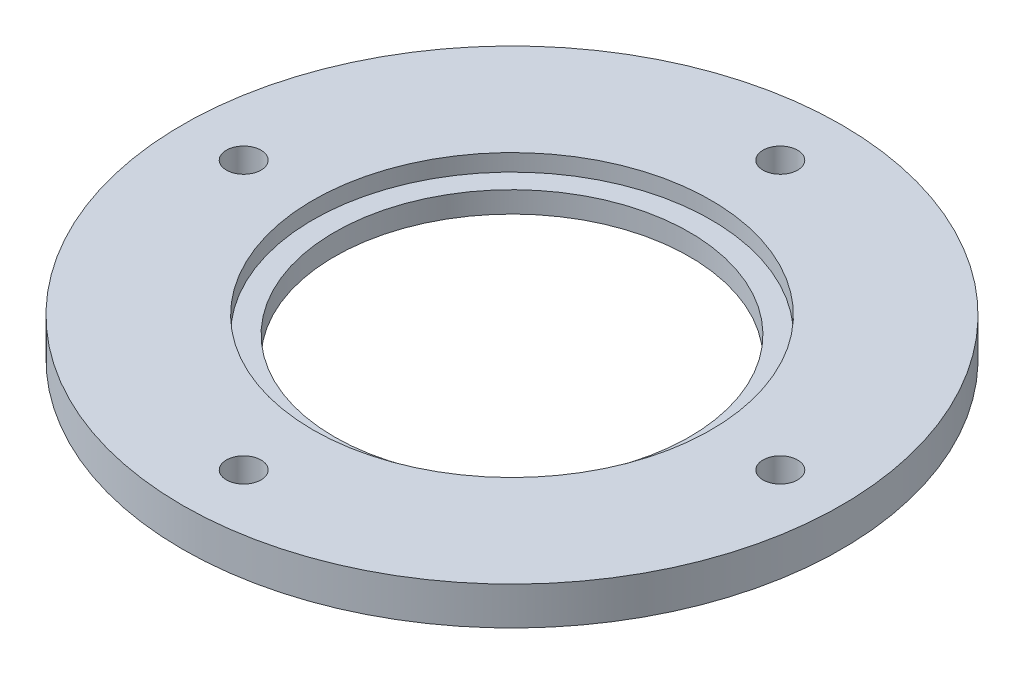
ISO-10303-21;
HEADER;
FILE_DESCRIPTION(('STEP AP214'),'2;1');
FILE_NAME('part.step','',(''),(''),'','','');
FILE_SCHEMA(('AUTOMOTIVE_DESIGN { 1 0 10303 214 1 1 1 1 }'));
ENDSEC;
DATA;
#1=APPLICATION_CONTEXT('core data for automotive mechanical design processes');
#2=APPLICATION_PROTOCOL_DEFINITION('international standard','automotive_design',2000,#1);
#3=PRODUCT_CONTEXT('',#1,'mechanical');
#4=PRODUCT('Part','Part','',(#3));
#5=PRODUCT_RELATED_PRODUCT_CATEGORY('part','',(#4));
#6=PRODUCT_DEFINITION_FORMATION('','',#4);
#7=PRODUCT_DEFINITION_CONTEXT('part definition',#1,'design');
#8=PRODUCT_DEFINITION('design','',#6,#7);
#9=PRODUCT_DEFINITION_SHAPE('','',#8);
#10=(LENGTH_UNIT() NAMED_UNIT(*) SI_UNIT(.MILLI.,.METRE.));
#11=(NAMED_UNIT(*) PLANE_ANGLE_UNIT() SI_UNIT($,.RADIAN.));
#12=(NAMED_UNIT(*) SI_UNIT($,.STERADIAN.) SOLID_ANGLE_UNIT());
#13=UNCERTAINTY_MEASURE_WITH_UNIT(LENGTH_MEASURE(1.E-05),#10,'distance_accuracy_value','');
#14=(GEOMETRIC_REPRESENTATION_CONTEXT(3) GLOBAL_UNCERTAINTY_ASSIGNED_CONTEXT((#13)) GLOBAL_UNIT_ASSIGNED_CONTEXT((#10,
#11,#12)) REPRESENTATION_CONTEXT('',''));
#15=CARTESIAN_POINT('',(0.,0.,0.));
#16=DIRECTION('',(0.,0.,1.));
#17=DIRECTION('',(1.,0.,0.));
#18=AXIS2_PLACEMENT_3D('',#15,#16,#17);
#19=CARTESIAN_POINT('',(0.,0.,0.));
#20=DIRECTION('',(0.,1.,0.));
#21=DIRECTION('',(0.,0.,1.));
#22=AXIS2_PLACEMENT_3D('',#19,#20,#21);
#23=CYLINDRICAL_SURFACE('',#22,21.);
#24=CARTESIAN_POINT('',(0.,0.,0.));
#25=DIRECTION('',(0.,1.,0.));
#26=DIRECTION('',(0.,0.,1.));
#27=AXIS2_PLACEMENT_3D('',#24,#25,#26);
#28=CIRCLE('',#27,21.);
#29=CARTESIAN_POINT('',(0.,0.,21.));
#30=VERTEX_POINT('',#29);
#31=EDGE_CURVE('E50',#30,#30,#28,.T.);
#32=ORIENTED_EDGE('',*,*,#31,.F.);
#33=EDGE_LOOP('',(#32));
#34=FACE_BOUND('',#33,.T.);
#35=CARTESIAN_POINT('',(0.,2.5,0.));
#36=DIRECTION('',(0.,1.,0.));
#37=DIRECTION('',(0.,0.,1.));
#38=AXIS2_PLACEMENT_3D('',#35,#36,#37);
#39=CIRCLE('',#38,21.);
#40=CARTESIAN_POINT('',(0.,2.5,21.));
#41=VERTEX_POINT('',#40);
#42=EDGE_CURVE('E35',#41,#41,#39,.F.);
#43=ORIENTED_EDGE('',*,*,#42,.F.);
#44=EDGE_LOOP('',(#43));
#45=FACE_BOUND('',#44,.T.);
#46=ADVANCED_FACE('F31',(#34,#45),#23,.F.);
#47=CARTESIAN_POINT('',(0.,4.5,0.));
#48=DIRECTION('',(0.,-1.,0.));
#49=DIRECTION('',(0.,0.,-1.));
#50=AXIS2_PLACEMENT_3D('',#47,#48,#49);
#51=CYLINDRICAL_SURFACE('',#50,39.);
#52=CARTESIAN_POINT('',(0.,4.5,0.));
#53=DIRECTION('',(0.,1.,0.));
#54=DIRECTION('',(0.,0.,1.));
#55=AXIS2_PLACEMENT_3D('',#52,#53,#54);
#56=CIRCLE('',#55,39.);
#57=CARTESIAN_POINT('',(0.,4.5,39.));
#58=VERTEX_POINT('',#57);
#59=EDGE_CURVE('E10',#58,#58,#56,.T.);
#60=ORIENTED_EDGE('',*,*,#59,.F.);
#61=EDGE_LOOP('',(#60));
#62=FACE_BOUND('',#61,.T.);
#63=CARTESIAN_POINT('',(0.,0.,0.));
#64=DIRECTION('',(0.,1.,0.));
#65=DIRECTION('',(0.,0.,1.));
#66=AXIS2_PLACEMENT_3D('',#63,#64,#65);
#67=CIRCLE('',#66,39.);
#68=CARTESIAN_POINT('',(0.,0.,39.));
#69=VERTEX_POINT('',#68);
#70=EDGE_CURVE('E39',#69,#69,#67,.T.);
#71=ORIENTED_EDGE('',*,*,#70,.T.);
#72=EDGE_LOOP('',(#71));
#73=FACE_BOUND('',#72,.T.);
#74=ADVANCED_FACE('F33',(#62,#73),#51,.T.);
#75=CARTESIAN_POINT('',(0.,4.5,0.));
#76=DIRECTION('',(0.,1.,0.));
#77=DIRECTION('',(0.,0.,1.));
#78=AXIS2_PLACEMENT_3D('',#75,#76,#77);
#79=PLANE('',#78);
#80=CARTESIAN_POINT('',(0.,4.5,0.));
#81=DIRECTION('',(0.,1.,0.));
#82=DIRECTION('',(0.,0.,1.));
#83=AXIS2_PLACEMENT_3D('',#80,#81,#82);
#84=CIRCLE('',#83,23.55);
#85=CARTESIAN_POINT('',(0.,4.5,23.55));
#86=VERTEX_POINT('',#85);
#87=EDGE_CURVE('E72',#86,#86,#84,.T.);
#88=ORIENTED_EDGE('',*,*,#87,.F.);
#89=EDGE_LOOP('',(#88));
#90=FACE_BOUND('',#89,.T.);
#91=CARTESIAN_POINT('',(31.75,4.5,0.));
#92=DIRECTION('',(0.,1.,0.));
#93=DIRECTION('',(0.,0.,1.));
#94=AXIS2_PLACEMENT_3D('',#91,#92,#93);
#95=CIRCLE('',#94,2.04999999999999);
#96=CARTESIAN_POINT('',(31.75,4.5,2.04999999999999));
#97=VERTEX_POINT('',#96);
#98=EDGE_CURVE('E65',#97,#97,#95,.T.);
#99=ORIENTED_EDGE('',*,*,#98,.F.);
#100=EDGE_LOOP('',(#99));
#101=FACE_BOUND('',#100,.T.);
#102=CARTESIAN_POINT('',(-1.10854532508269E-13,4.5,31.75));
#103=DIRECTION('',(0.,1.,0.));
#104=DIRECTION('',(0.,0.,1.));
#105=AXIS2_PLACEMENT_3D('',#102,#103,#104);
#106=CIRCLE('',#105,2.05);
#107=CARTESIAN_POINT('',(-1.10854532508269E-13,4.5,33.8));
#108=VERTEX_POINT('',#107);
#109=EDGE_CURVE('E59',#108,#108,#106,.T.);
#110=ORIENTED_EDGE('',*,*,#109,.F.);
#111=EDGE_LOOP('',(#110));
#112=FACE_BOUND('',#111,.T.);
#113=CARTESIAN_POINT('',(-31.75,4.5,-2.21709065016539E-13));
#114=DIRECTION('',(0.,1.,0.));
#115=DIRECTION('',(0.,0.,1.));
#116=AXIS2_PLACEMENT_3D('',#113,#114,#115);
#117=CIRCLE('',#116,2.05);
#118=CARTESIAN_POINT('',(-31.75,4.5,2.04999999999978));
#119=VERTEX_POINT('',#118);
#120=EDGE_CURVE('E53',#119,#119,#117,.T.);
#121=ORIENTED_EDGE('',*,*,#120,.F.);
#122=EDGE_LOOP('',(#121));
#123=FACE_BOUND('',#122,.T.);
#124=CARTESIAN_POINT('',(3.32563597524808E-13,4.5,-31.75));
#125=DIRECTION('',(0.,1.,0.));
#126=DIRECTION('',(0.,0.,1.));
#127=AXIS2_PLACEMENT_3D('',#124,#125,#126);
#128=CIRCLE('',#127,2.05);
#129=CARTESIAN_POINT('',(3.32563597524808E-13,4.5,-29.7));
#130=VERTEX_POINT('',#129);
#131=EDGE_CURVE('E46',#130,#130,#128,.T.);
#132=ORIENTED_EDGE('',*,*,#131,.F.);
#133=EDGE_LOOP('',(#132));
#134=FACE_BOUND('',#133,.T.);
#135=ORIENTED_EDGE('',*,*,#59,.T.);
#136=EDGE_LOOP('',(#135));
#137=FACE_BOUND('',#136,.T.);
#138=ADVANCED_FACE('F90',(#90,#101,#112,#123,#134,#137),#79,.T.);
#139=CARTESIAN_POINT('',(0.,0.,0.));
#140=DIRECTION('',(0.,1.,0.));
#141=DIRECTION('',(0.,0.,1.));
#142=AXIS2_PLACEMENT_3D('',#139,#140,#141);
#143=PLANE('',#142);
#144=ORIENTED_EDGE('',*,*,#31,.T.);
#145=EDGE_LOOP('',(#144));
#146=FACE_BOUND('',#145,.T.);
#147=CARTESIAN_POINT('',(31.75,0.,0.));
#148=DIRECTION('',(0.,1.,0.));
#149=DIRECTION('',(0.,0.,1.));
#150=AXIS2_PLACEMENT_3D('',#147,#148,#149);
#151=CIRCLE('',#150,2.04999999999999);
#152=CARTESIAN_POINT('',(31.75,0.,2.04999999999999));
#153=VERTEX_POINT('',#152);
#154=EDGE_CURVE('E44',#153,#153,#151,.T.);
#155=ORIENTED_EDGE('',*,*,#154,.T.);
#156=EDGE_LOOP('',(#155));
#157=FACE_BOUND('',#156,.T.);
#158=CARTESIAN_POINT('',(-1.10854532508269E-13,0.,31.75));
#159=DIRECTION('',(0.,1.,0.));
#160=DIRECTION('',(0.,0.,1.));
#161=AXIS2_PLACEMENT_3D('',#158,#159,#160);
#162=CIRCLE('',#161,2.05);
#163=CARTESIAN_POINT('',(-1.10854532508269E-13,0.,33.8));
#164=VERTEX_POINT('',#163);
#165=EDGE_CURVE('E62',#164,#164,#162,.T.);
#166=ORIENTED_EDGE('',*,*,#165,.T.);
#167=EDGE_LOOP('',(#166));
#168=FACE_BOUND('',#167,.T.);
#169=CARTESIAN_POINT('',(-31.75,0.,-2.21709065016539E-13));
#170=DIRECTION('',(0.,1.,0.));
#171=DIRECTION('',(0.,0.,1.));
#172=AXIS2_PLACEMENT_3D('',#169,#170,#171);
#173=CIRCLE('',#172,2.05);
#174=CARTESIAN_POINT('',(-31.75,0.,2.04999999999978));
#175=VERTEX_POINT('',#174);
#176=EDGE_CURVE('E56',#175,#175,#173,.T.);
#177=ORIENTED_EDGE('',*,*,#176,.T.);
#178=EDGE_LOOP('',(#177));
#179=FACE_BOUND('',#178,.T.);
#180=CARTESIAN_POINT('',(3.32563597524808E-13,0.,-31.75));
#181=DIRECTION('',(0.,1.,0.));
#182=DIRECTION('',(0.,0.,1.));
#183=AXIS2_PLACEMENT_3D('',#180,#181,#182);
#184=CIRCLE('',#183,2.05);
#185=CARTESIAN_POINT('',(3.32563597524808E-13,0.,-29.7));
#186=VERTEX_POINT('',#185);
#187=EDGE_CURVE('E49',#186,#186,#184,.T.);
#188=ORIENTED_EDGE('',*,*,#187,.T.);
#189=EDGE_LOOP('',(#188));
#190=FACE_BOUND('',#189,.T.);
#191=ORIENTED_EDGE('',*,*,#70,.F.);
#192=EDGE_LOOP('',(#191));
#193=FACE_BOUND('',#192,.T.);
#194=ADVANCED_FACE('F112',(#146,#157,#168,#179,#190,#193),#143,.F.);
#195=CARTESIAN_POINT('',(3.32563597524808E-13,0.,-31.75));
#196=DIRECTION('',(0.,1.,0.));
#197=DIRECTION('',(0.,0.,1.));
#198=AXIS2_PLACEMENT_3D('',#195,#196,#197);
#199=CYLINDRICAL_SURFACE('',#198,2.05);
#200=ORIENTED_EDGE('',*,*,#187,.F.);
#201=EDGE_LOOP('',(#200));
#202=FACE_BOUND('',#201,.T.);
#203=ORIENTED_EDGE('',*,*,#131,.T.);
#204=EDGE_LOOP('',(#203));
#205=FACE_BOUND('',#204,.T.);
#206=ADVANCED_FACE('F108',(#202,#205),#199,.F.);
#207=CARTESIAN_POINT('',(-31.75,0.,-2.21709065016539E-13));
#208=DIRECTION('',(0.,1.,0.));
#209=DIRECTION('',(0.,0.,1.));
#210=AXIS2_PLACEMENT_3D('',#207,#208,#209);
#211=CYLINDRICAL_SURFACE('',#210,2.05);
#212=ORIENTED_EDGE('',*,*,#176,.F.);
#213=EDGE_LOOP('',(#212));
#214=FACE_BOUND('',#213,.T.);
#215=ORIENTED_EDGE('',*,*,#120,.T.);
#216=EDGE_LOOP('',(#215));
#217=FACE_BOUND('',#216,.T.);
#218=ADVANCED_FACE('F104',(#214,#217),#211,.F.);
#219=CARTESIAN_POINT('',(-1.10854532508269E-13,0.,31.75));
#220=DIRECTION('',(0.,1.,0.));
#221=DIRECTION('',(0.,0.,1.));
#222=AXIS2_PLACEMENT_3D('',#219,#220,#221);
#223=CYLINDRICAL_SURFACE('',#222,2.05);
#224=ORIENTED_EDGE('',*,*,#165,.F.);
#225=EDGE_LOOP('',(#224));
#226=FACE_BOUND('',#225,.T.);
#227=ORIENTED_EDGE('',*,*,#109,.T.);
#228=EDGE_LOOP('',(#227));
#229=FACE_BOUND('',#228,.T.);
#230=ADVANCED_FACE('F100',(#226,#229),#223,.F.);
#231=CARTESIAN_POINT('',(31.75,0.,0.));
#232=DIRECTION('',(0.,1.,0.));
#233=DIRECTION('',(0.,0.,1.));
#234=AXIS2_PLACEMENT_3D('',#231,#232,#233);
#235=CYLINDRICAL_SURFACE('',#234,2.04999999999999);
#236=ORIENTED_EDGE('',*,*,#154,.F.);
#237=EDGE_LOOP('',(#236));
#238=FACE_BOUND('',#237,.T.);
#239=ORIENTED_EDGE('',*,*,#98,.T.);
#240=EDGE_LOOP('',(#239));
#241=FACE_BOUND('',#240,.T.);
#242=ADVANCED_FACE('F97',(#238,#241),#235,.F.);
#243=CARTESIAN_POINT('',(0.,2.5,0.));
#244=DIRECTION('',(0.,1.,0.));
#245=DIRECTION('',(0.,0.,1.));
#246=AXIS2_PLACEMENT_3D('',#243,#244,#245);
#247=PLANE('',#246);
#248=CARTESIAN_POINT('',(0.,2.5,0.));
#249=DIRECTION('',(0.,1.,0.));
#250=DIRECTION('',(0.,0.,1.));
#251=AXIS2_PLACEMENT_3D('',#248,#249,#250);
#252=CIRCLE('',#251,23.55);
#253=CARTESIAN_POINT('',(0.,2.5,23.55));
#254=VERTEX_POINT('',#253);
#255=EDGE_CURVE('E75',#254,#254,#252,.T.);
#256=ORIENTED_EDGE('',*,*,#255,.T.);
#257=EDGE_LOOP('',(#256));
#258=FACE_BOUND('',#257,.T.);
#259=ORIENTED_EDGE('',*,*,#42,.T.);
#260=EDGE_LOOP('',(#259));
#261=FACE_BOUND('',#260,.T.);
#262=ADVANCED_FACE('F82',(#258,#261),#247,.T.);
#263=CARTESIAN_POINT('',(0.,2.5,0.));
#264=DIRECTION('',(0.,1.,0.));
#265=DIRECTION('',(0.,0.,1.));
#266=AXIS2_PLACEMENT_3D('',#263,#264,#265);
#267=CYLINDRICAL_SURFACE('',#266,23.55);
#268=ORIENTED_EDGE('',*,*,#255,.F.);
#269=EDGE_LOOP('',(#268));
#270=FACE_BOUND('',#269,.T.);
#271=ORIENTED_EDGE('',*,*,#87,.T.);
#272=EDGE_LOOP('',(#271));
#273=FACE_BOUND('',#272,.T.);
#274=ADVANCED_FACE('F95',(#270,#273),#267,.F.);
#275=CLOSED_SHELL('',(#46,#74,#138,#194,#206,#218,#230,#242,#262,#274));
#276=MANIFOLD_SOLID_BREP('B2',#275);
#277=ADVANCED_BREP_SHAPE_REPRESENTATION('',(#18,#276),#14);
#278=SHAPE_DEFINITION_REPRESENTATION(#9,#277);
ENDSEC;
END-ISO-10303-21;
